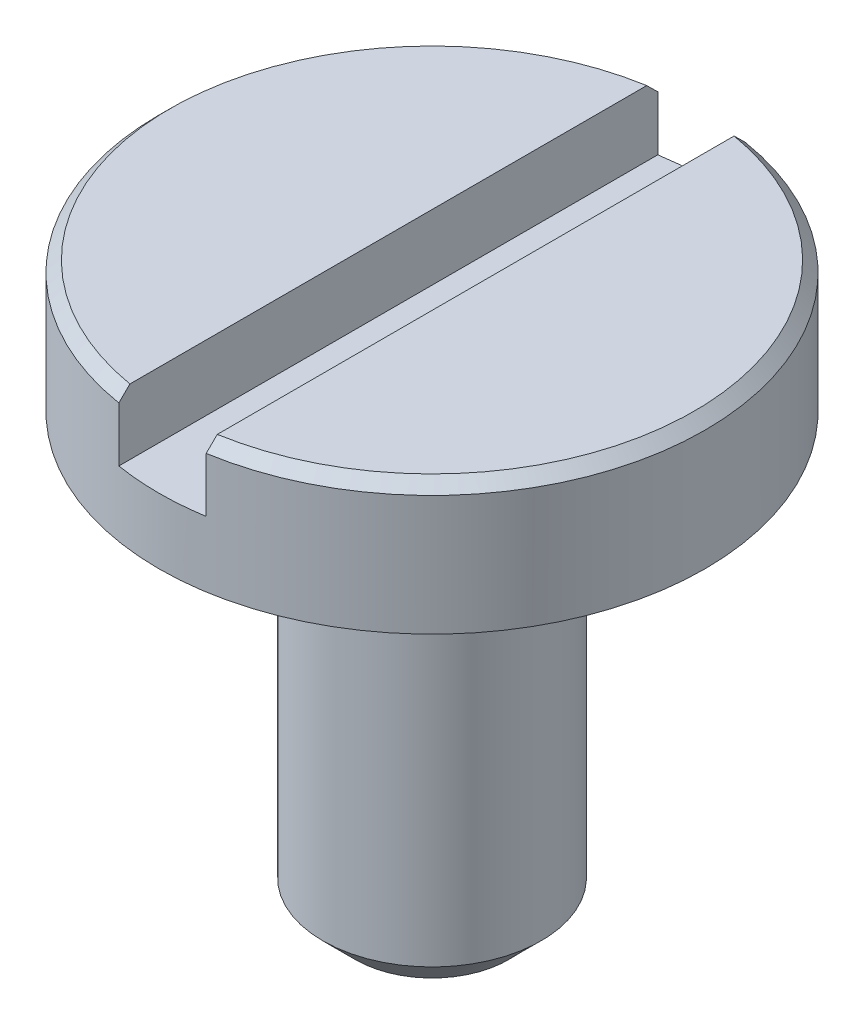
ISO-10303-21;
HEADER;
FILE_DESCRIPTION(('STEP AP214'),'2;1');
FILE_NAME('part.step','',(''),(''),'','','');
FILE_SCHEMA(('AUTOMOTIVE_DESIGN { 1 0 10303 214 1 1 1 1 }'));
ENDSEC;
DATA;
#1=APPLICATION_CONTEXT('core data for automotive mechanical design processes');
#2=APPLICATION_PROTOCOL_DEFINITION('international standard','automotive_design',2000,#1);
#3=PRODUCT_CONTEXT('',#1,'mechanical');
#4=PRODUCT('Part','Part','',(#3));
#5=PRODUCT_RELATED_PRODUCT_CATEGORY('part','',(#4));
#6=PRODUCT_DEFINITION_FORMATION('','',#4);
#7=PRODUCT_DEFINITION_CONTEXT('part definition',#1,'design');
#8=PRODUCT_DEFINITION('design','',#6,#7);
#9=PRODUCT_DEFINITION_SHAPE('','',#8);
#10=(LENGTH_UNIT() NAMED_UNIT(*) SI_UNIT(.MILLI.,.METRE.));
#11=(NAMED_UNIT(*) PLANE_ANGLE_UNIT() SI_UNIT($,.RADIAN.));
#12=(NAMED_UNIT(*) SI_UNIT($,.STERADIAN.) SOLID_ANGLE_UNIT());
#13=UNCERTAINTY_MEASURE_WITH_UNIT(LENGTH_MEASURE(1.E-05),#10,'distance_accuracy_value','');
#14=(GEOMETRIC_REPRESENTATION_CONTEXT(3) GLOBAL_UNCERTAINTY_ASSIGNED_CONTEXT((#13)) GLOBAL_UNIT_ASSIGNED_CONTEXT((#10,
#11,#12)) REPRESENTATION_CONTEXT('',''));
#15=CARTESIAN_POINT('',(0.,0.,0.));
#16=DIRECTION('',(0.,0.,1.));
#17=DIRECTION('',(1.,0.,0.));
#18=AXIS2_PLACEMENT_3D('',#15,#16,#17);
#19=CARTESIAN_POINT('',(1.25,2.6,0.));
#20=DIRECTION('',(0.,-1.,0.));
#21=DIRECTION('',(0.,0.,-1.));
#22=AXIS2_PLACEMENT_3D('',#19,#20,#21);
#23=PLANE('',#22);
#24=DIRECTION('',(0.,0.,-1.));
#25=VECTOR('',#24,1.);
#26=CARTESIAN_POINT('',(-0.2,2.6,0.));
#27=LINE('',#26,#25);
#28=CARTESIAN_POINT('',(-0.2,2.6,1.18321595661992));
#29=VERTEX_POINT('',#28);
#30=CARTESIAN_POINT('',(-0.2,2.6,-1.18321595661992));
#31=VERTEX_POINT('',#30);
#32=EDGE_CURVE('E119',#29,#31,#27,.T.);
#33=ORIENTED_EDGE('',*,*,#32,.T.);
#34=CARTESIAN_POINT('',(0.,2.6,0.));
#35=DIRECTION('',(0.,-1.,0.));
#36=DIRECTION('',(0.,0.,-1.));
#37=AXIS2_PLACEMENT_3D('',#34,#35,#36);
#38=CIRCLE('',#37,1.2);
#39=EDGE_CURVE('E159',#31,#29,#38,.F.);
#40=ORIENTED_EDGE('',*,*,#39,.T.);
#41=EDGE_LOOP('',(#33,#40));
#42=FACE_BOUND('',#41,.T.);
#43=ADVANCED_FACE('F17',(#42),#23,.F.);
#44=CARTESIAN_POINT('',(0.,0.,0.));
#45=DIRECTION('',(0.,1.,0.));
#46=DIRECTION('',(0.,0.,1.));
#47=AXIS2_PLACEMENT_3D('',#44,#45,#46);
#48=PLANE('',#47);
#49=CARTESIAN_POINT('',(0.,0.,0.));
#50=DIRECTION('',(0.,1.,0.));
#51=DIRECTION('',(0.,0.,1.));
#52=AXIS2_PLACEMENT_3D('',#49,#50,#51);
#53=CIRCLE('',#52,0.35);
#54=CARTESIAN_POINT('',(0.,0.,0.35));
#55=VERTEX_POINT('',#54);
#56=EDGE_CURVE('E123',#55,#55,#53,.F.);
#57=ORIENTED_EDGE('',*,*,#56,.T.);
#58=EDGE_LOOP('',(#57));
#59=FACE_BOUND('',#58,.T.);
#60=ADVANCED_FACE('F176',(#59),#48,.F.);
#61=CARTESIAN_POINT('',(0.,0.,0.));
#62=DIRECTION('',(0.,1.,0.));
#63=DIRECTION('',(0.,0.,1.));
#64=AXIS2_PLACEMENT_3D('',#61,#62,#63);
#65=CYLINDRICAL_SURFACE('',#64,0.5);
#66=CARTESIAN_POINT('',(0.,0.15,0.));
#67=DIRECTION('',(0.,1.,0.));
#68=DIRECTION('',(0.,0.,1.));
#69=AXIS2_PLACEMENT_3D('',#66,#67,#68);
#70=CIRCLE('',#69,0.5);
#71=CARTESIAN_POINT('',(0.,0.15,0.5));
#72=VERTEX_POINT('',#71);
#73=EDGE_CURVE('E86',#72,#72,#70,.T.);
#74=ORIENTED_EDGE('',*,*,#73,.T.);
#75=EDGE_LOOP('',(#74));
#76=FACE_BOUND('',#75,.T.);
#77=CARTESIAN_POINT('',(0.,2.,0.));
#78=DIRECTION('',(0.,1.,0.));
#79=DIRECTION('',(0.,0.,1.));
#80=AXIS2_PLACEMENT_3D('',#77,#78,#79);
#81=CIRCLE('',#80,0.5);
#82=CARTESIAN_POINT('',(0.,2.,0.5));
#83=VERTEX_POINT('',#82);
#84=EDGE_CURVE('E113',#83,#83,#81,.T.);
#85=ORIENTED_EDGE('',*,*,#84,.F.);
#86=EDGE_LOOP('',(#85));
#87=FACE_BOUND('',#86,.T.);
#88=ADVANCED_FACE('F181',(#76,#87),#65,.T.);
#89=CARTESIAN_POINT('',(0.5,2.,0.));
#90=DIRECTION('',(0.,1.,0.));
#91=DIRECTION('',(0.,0.,1.));
#92=AXIS2_PLACEMENT_3D('',#89,#90,#91);
#93=PLANE('',#92);
#94=CARTESIAN_POINT('',(0.,2.,0.));
#95=DIRECTION('',(0.,1.,0.));
#96=DIRECTION('',(0.,0.,1.));
#97=AXIS2_PLACEMENT_3D('',#94,#95,#96);
#98=CIRCLE('',#97,1.25);
#99=CARTESIAN_POINT('',(0.,2.,1.25));
#100=VERTEX_POINT('',#99);
#101=EDGE_CURVE('E110',#100,#100,#98,.T.);
#102=ORIENTED_EDGE('',*,*,#101,.F.);
#103=EDGE_LOOP('',(#102));
#104=FACE_BOUND('',#103,.T.);
#105=ORIENTED_EDGE('',*,*,#84,.T.);
#106=EDGE_LOOP('',(#105));
#107=FACE_BOUND('',#106,.T.);
#108=ADVANCED_FACE('F174',(#104,#107),#93,.F.);
#109=CARTESIAN_POINT('',(0.,0.,0.));
#110=DIRECTION('',(0.,1.,0.));
#111=DIRECTION('',(0.,0.,1.));
#112=AXIS2_PLACEMENT_3D('',#109,#110,#111);
#113=CYLINDRICAL_SURFACE('',#112,1.25);
#114=DIRECTION('',(0.,1.,0.));
#115=VECTOR('',#114,1.);
#116=CARTESIAN_POINT('',(0.2,0.,-1.23389626792531));
#117=LINE('',#116,#115);
#118=CARTESIAN_POINT('',(0.2,2.3,-1.23389626792531));
#119=VERTEX_POINT('',#118);
#120=CARTESIAN_POINT('',(0.2,2.55,-1.23389626792531));
#121=VERTEX_POINT('',#120);
#122=EDGE_CURVE('E79',#119,#121,#117,.T.);
#123=ORIENTED_EDGE('',*,*,#122,.T.);
#124=CARTESIAN_POINT('',(0.,2.55,0.));
#125=DIRECTION('',(0.,-1.,0.));
#126=DIRECTION('',(0.,0.,-1.));
#127=AXIS2_PLACEMENT_3D('',#124,#125,#126);
#128=CIRCLE('',#127,1.25);
#129=CARTESIAN_POINT('',(0.2,2.55,1.23389626792531));
#130=VERTEX_POINT('',#129);
#131=EDGE_CURVE('E161',#121,#130,#128,.T.);
#132=ORIENTED_EDGE('',*,*,#131,.T.);
#133=DIRECTION('',(0.,1.,0.));
#134=VECTOR('',#133,1.);
#135=CARTESIAN_POINT('',(0.2,0.,1.23389626792531));
#136=LINE('',#135,#134);
#137=CARTESIAN_POINT('',(0.2,2.3,1.23389626792531));
#138=VERTEX_POINT('',#137);
#139=EDGE_CURVE('E96',#130,#138,#136,.F.);
#140=ORIENTED_EDGE('',*,*,#139,.T.);
#141=CARTESIAN_POINT('',(0.,2.3,0.));
#142=DIRECTION('',(0.,-1.,0.));
#143=DIRECTION('',(0.,0.,-1.));
#144=AXIS2_PLACEMENT_3D('',#141,#142,#143);
#145=CIRCLE('',#144,1.25);
#146=CARTESIAN_POINT('',(-0.2,2.3,1.23389626792531));
#147=VERTEX_POINT('',#146);
#148=EDGE_CURVE('E87',#138,#147,#145,.T.);
#149=ORIENTED_EDGE('',*,*,#148,.T.);
#150=DIRECTION('',(0.,1.,0.));
#151=VECTOR('',#150,1.);
#152=CARTESIAN_POINT('',(-0.2,0.,1.23389626792531));
#153=LINE('',#152,#151);
#154=CARTESIAN_POINT('',(-0.2,2.55,1.23389626792531));
#155=VERTEX_POINT('',#154);
#156=EDGE_CURVE('E107',#147,#155,#153,.T.);
#157=ORIENTED_EDGE('',*,*,#156,.T.);
#158=CARTESIAN_POINT('',(0.,2.55,0.));
#159=DIRECTION('',(0.,-1.,0.));
#160=DIRECTION('',(0.,0.,-1.));
#161=AXIS2_PLACEMENT_3D('',#158,#159,#160);
#162=CIRCLE('',#161,1.25);
#163=CARTESIAN_POINT('',(-0.2,2.55,-1.23389626792531));
#164=VERTEX_POINT('',#163);
#165=EDGE_CURVE('E162',#155,#164,#162,.T.);
#166=ORIENTED_EDGE('',*,*,#165,.T.);
#167=DIRECTION('',(0.,1.,0.));
#168=VECTOR('',#167,1.);
#169=CARTESIAN_POINT('',(-0.2,0.,-1.23389626792531));
#170=LINE('',#169,#168);
#171=CARTESIAN_POINT('',(-0.2,2.3,-1.23389626792531));
#172=VERTEX_POINT('',#171);
#173=EDGE_CURVE('E81',#164,#172,#170,.F.);
#174=ORIENTED_EDGE('',*,*,#173,.T.);
#175=EDGE_CURVE('E75',#172,#119,#145,.T.);
#176=ORIENTED_EDGE('',*,*,#175,.T.);
#177=EDGE_LOOP('',(#123,#132,#140,#149,#157,#166,#174,#176));
#178=FACE_BOUND('',#177,.T.);
#179=ORIENTED_EDGE('',*,*,#101,.T.);
#180=EDGE_LOOP('',(#179));
#181=FACE_BOUND('',#180,.T.);
#182=ADVANCED_FACE('F77',(#178,#181),#113,.T.);
#183=DIRECTION('',(0.,0.,1.));
#184=VECTOR('',#183,1.);
#185=CARTESIAN_POINT('',(0.2,2.6,0.));
#186=LINE('',#185,#184);
#187=CARTESIAN_POINT('',(0.2,2.6,-1.18321595661992));
#188=VERTEX_POINT('',#187);
#189=CARTESIAN_POINT('',(0.2,2.6,1.18321595661992));
#190=VERTEX_POINT('',#189);
#191=EDGE_CURVE('E116',#188,#190,#186,.T.);
#192=ORIENTED_EDGE('',*,*,#191,.T.);
#193=CARTESIAN_POINT('',(0.,2.6,0.));
#194=DIRECTION('',(0.,-1.,0.));
#195=DIRECTION('',(0.,0.,-1.));
#196=AXIS2_PLACEMENT_3D('',#193,#194,#195);
#197=CIRCLE('',#196,1.2);
#198=EDGE_CURVE('E126',#190,#188,#197,.F.);
#199=ORIENTED_EDGE('',*,*,#198,.T.);
#200=EDGE_LOOP('',(#192,#199));
#201=FACE_BOUND('',#200,.T.);
#202=ADVANCED_FACE('F149',(#201),#23,.F.);
#203=CARTESIAN_POINT('',(-0.2,2.3,-1.25));
#204=DIRECTION('',(0.,-1.,0.));
#205=DIRECTION('',(0.,0.,-1.));
#206=AXIS2_PLACEMENT_3D('',#203,#204,#205);
#207=PLANE('',#206);
#208=DIRECTION('',(0.,0.,1.));
#209=VECTOR('',#208,1.);
#210=CARTESIAN_POINT('',(0.2,2.3,-1.25));
#211=LINE('',#210,#209);
#212=EDGE_CURVE('E94',#119,#138,#211,.T.);
#213=ORIENTED_EDGE('',*,*,#212,.F.);
#214=ORIENTED_EDGE('',*,*,#175,.F.);
#215=DIRECTION('',(0.,0.,1.));
#216=VECTOR('',#215,1.);
#217=CARTESIAN_POINT('',(-0.2,2.3,-1.25));
#218=LINE('',#217,#216);
#219=EDGE_CURVE('E101',#172,#147,#218,.T.);
#220=ORIENTED_EDGE('',*,*,#219,.T.);
#221=ORIENTED_EDGE('',*,*,#148,.F.);
#222=EDGE_LOOP('',(#213,#214,#220,#221));
#223=FACE_BOUND('',#222,.T.);
#224=ADVANCED_FACE('F99',(#223),#207,.F.);
#225=CARTESIAN_POINT('',(-0.2,2.6,-1.25));
#226=DIRECTION('',(-1.,0.,0.));
#227=DIRECTION('',(0.,-1.,0.));
#228=AXIS2_PLACEMENT_3D('',#225,#226,#227);
#229=PLANE('',#228);
#230=ORIENTED_EDGE('',*,*,#32,.F.);
#231=CARTESIAN_POINT('',(-0.2,2.6,1.18321595661992));
#232=CARTESIAN_POINT('',(-0.2,2.59166902787292,1.19166500468787));
#233=CARTESIAN_POINT('',(-0.2,2.58333687514104,1.20011288799897));
#234=CARTESIAN_POINT('',(-0.2,2.56667020847438,1.21700632510077));
#235=CARTESIAN_POINT('',(-0.2,2.55833569453958,1.22545187889146));
#236=CARTESIAN_POINT('',(-0.2,2.55,1.23389626792531));
#237=B_SPLINE_CURVE_WITH_KNOTS('',3,(#231,#232,#233,#234,#235,#236),.UNSPECIFIED.,.F.,.F.,(4,2,
4),(0.,0.0355966784162151,0.0711933568040456),.UNSPECIFIED.);
#238=EDGE_CURVE('E11',#29,#155,#237,.T.);
#239=ORIENTED_EDGE('',*,*,#238,.T.);
#240=ORIENTED_EDGE('',*,*,#156,.F.);
#241=ORIENTED_EDGE('',*,*,#219,.F.);
#242=ORIENTED_EDGE('',*,*,#173,.F.);
#243=CARTESIAN_POINT('',(-0.2,2.55,-1.23389626792531));
#244=CARTESIAN_POINT('',(-0.2,2.55833569453958,-1.22545187889146));
#245=CARTESIAN_POINT('',(-0.2,2.56667020847438,-1.21700632510077));
#246=CARTESIAN_POINT('',(-0.2,2.58333687514104,-1.20011288799897));
#247=CARTESIAN_POINT('',(-0.2,2.59166902787292,-1.19166500468787));
#248=CARTESIAN_POINT('',(-0.2,2.6,-1.18321595661992));
#249=B_SPLINE_CURVE_WITH_KNOTS('',3,(#243,#244,#245,#246,#247,#248),.UNSPECIFIED.,.F.,.F.,(4,2,
4),(0.,0.0355966783878305,0.0711933568040456),.UNSPECIFIED.);
#250=EDGE_CURVE('E30',#164,#31,#249,.T.);
#251=ORIENTED_EDGE('',*,*,#250,.T.);
#252=EDGE_LOOP('',(#230,#239,#240,#241,#242,#251));
#253=FACE_BOUND('',#252,.T.);
#254=ADVANCED_FACE('F146',(#253),#229,.F.);
#255=CARTESIAN_POINT('',(0.2,2.6,-1.25));
#256=DIRECTION('',(1.,0.,0.));
#257=DIRECTION('',(0.,1.,0.));
#258=AXIS2_PLACEMENT_3D('',#255,#256,#257);
#259=PLANE('',#258);
#260=ORIENTED_EDGE('',*,*,#191,.F.);
#261=CARTESIAN_POINT('',(0.2,2.6,-1.18321595661992));
#262=CARTESIAN_POINT('',(0.2,2.59166902787292,-1.19166500468787));
#263=CARTESIAN_POINT('',(0.2,2.58333687514104,-1.20011288799897));
#264=CARTESIAN_POINT('',(0.2,2.56667020847438,-1.21700632510077));
#265=CARTESIAN_POINT('',(0.2,2.55833569453958,-1.22545187889146));
#266=CARTESIAN_POINT('',(0.2,2.55,-1.23389626792531));
#267=B_SPLINE_CURVE_WITH_KNOTS('',3,(#261,#262,#263,#264,#265,#266),.UNSPECIFIED.,.F.,.F.,(4,2,
4),(0.,0.0355966784162151,0.0711933568040456),.UNSPECIFIED.);
#268=EDGE_CURVE('E95',#188,#121,#267,.T.);
#269=ORIENTED_EDGE('',*,*,#268,.T.);
#270=ORIENTED_EDGE('',*,*,#122,.F.);
#271=ORIENTED_EDGE('',*,*,#212,.T.);
#272=ORIENTED_EDGE('',*,*,#139,.F.);
#273=CARTESIAN_POINT('',(0.2,2.55,1.23389626792531));
#274=CARTESIAN_POINT('',(0.2,2.55833569453958,1.22545187889146));
#275=CARTESIAN_POINT('',(0.2,2.56667020847438,1.21700632510077));
#276=CARTESIAN_POINT('',(0.2,2.58333687514104,1.20011288799897));
#277=CARTESIAN_POINT('',(0.2,2.59166902787292,1.19166500468787));
#278=CARTESIAN_POINT('',(0.2,2.6,1.18321595661992));
#279=B_SPLINE_CURVE_WITH_KNOTS('',3,(#273,#274,#275,#276,#277,#278),.UNSPECIFIED.,.F.,.F.,(4,2,
4),(0.,0.0355966783878305,0.0711933568040456),.UNSPECIFIED.);
#280=EDGE_CURVE('E129',#130,#190,#279,.T.);
#281=ORIENTED_EDGE('',*,*,#280,.T.);
#282=EDGE_LOOP('',(#260,#269,#270,#271,#272,#281));
#283=FACE_BOUND('',#282,.T.);
#284=ADVANCED_FACE('F92',(#283),#259,.F.);
#285=CARTESIAN_POINT('',(0.,0.15,0.));
#286=DIRECTION('',(0.,1.,0.));
#287=DIRECTION('',(0.,0.,1.));
#288=AXIS2_PLACEMENT_3D('',#285,#286,#287);
#289=CONICAL_SURFACE('',#288,0.5,0.78539816339745);
#290=ORIENTED_EDGE('',*,*,#56,.F.);
#291=EDGE_LOOP('',(#290));
#292=FACE_BOUND('',#291,.T.);
#293=ORIENTED_EDGE('',*,*,#73,.F.);
#294=EDGE_LOOP('',(#293));
#295=FACE_BOUND('',#294,.T.);
#296=ADVANCED_FACE('F145',(#292,#295),#289,.T.);
#297=CARTESIAN_POINT('',(0.,2.6,0.));
#298=DIRECTION('',(0.,-1.,0.));
#299=DIRECTION('',(0.,0.,-1.));
#300=AXIS2_PLACEMENT_3D('',#297,#298,#299);
#301=CONICAL_SURFACE('',#300,1.2,0.785398163397444);
#302=ORIENTED_EDGE('',*,*,#280,.F.);
#303=ORIENTED_EDGE('',*,*,#131,.F.);
#304=ORIENTED_EDGE('',*,*,#268,.F.);
#305=ORIENTED_EDGE('',*,*,#198,.F.);
#306=EDGE_LOOP('',(#302,#303,#304,#305));
#307=FACE_BOUND('',#306,.T.);
#308=ADVANCED_FACE('F139',(#307),#301,.T.);
#309=CARTESIAN_POINT('',(0.,2.6,0.));
#310=DIRECTION('',(0.,-1.,0.));
#311=DIRECTION('',(0.,0.,-1.));
#312=AXIS2_PLACEMENT_3D('',#309,#310,#311);
#313=CONICAL_SURFACE('',#312,1.2,0.785398163397444);
#314=ORIENTED_EDGE('',*,*,#250,.F.);
#315=ORIENTED_EDGE('',*,*,#165,.F.);
#316=ORIENTED_EDGE('',*,*,#238,.F.);
#317=ORIENTED_EDGE('',*,*,#39,.F.);
#318=EDGE_LOOP('',(#314,#315,#316,#317));
#319=FACE_BOUND('',#318,.T.);
#320=ADVANCED_FACE('F19',(#319),#313,.T.);
#321=CLOSED_SHELL('',(#43,#60,#88,#108,#182,#202,#224,#254,#284,#296,#308,#320));
#322=MANIFOLD_SOLID_BREP('B1',#321);
#323=ADVANCED_BREP_SHAPE_REPRESENTATION('',(#18,#322),#14);
#324=SHAPE_DEFINITION_REPRESENTATION(#9,#323);
ENDSEC;
END-ISO-10303-21;
